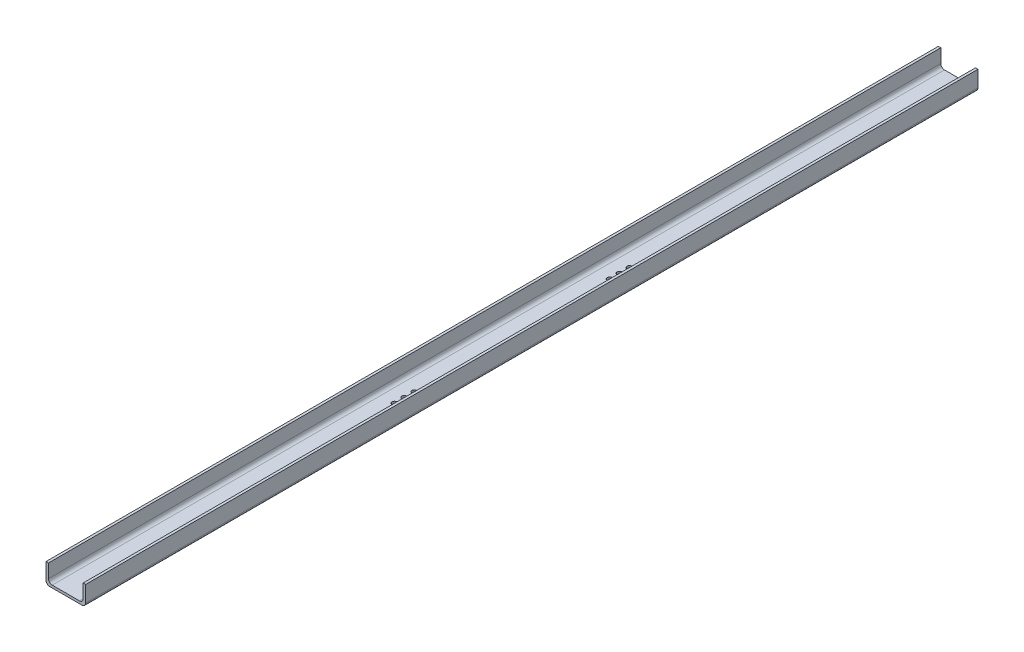
ISO-10303-21;
HEADER;
FILE_DESCRIPTION(('STEP AP214'),'2;1');
FILE_NAME('part.step','',(''),(''),'','','');
FILE_SCHEMA(('AUTOMOTIVE_DESIGN { 1 0 10303 214 1 1 1 1 }'));
ENDSEC;
DATA;
#1=APPLICATION_CONTEXT('core data for automotive mechanical design processes');
#2=APPLICATION_PROTOCOL_DEFINITION('international standard','automotive_design',2000,#1);
#3=PRODUCT_CONTEXT('',#1,'mechanical');
#4=PRODUCT('Part','Part','',(#3));
#5=PRODUCT_RELATED_PRODUCT_CATEGORY('part','',(#4));
#6=PRODUCT_DEFINITION_FORMATION('','',#4);
#7=PRODUCT_DEFINITION_CONTEXT('part definition',#1,'design');
#8=PRODUCT_DEFINITION('design','',#6,#7);
#9=PRODUCT_DEFINITION_SHAPE('','',#8);
#10=(LENGTH_UNIT() NAMED_UNIT(*) SI_UNIT(.MILLI.,.METRE.));
#11=(NAMED_UNIT(*) PLANE_ANGLE_UNIT() SI_UNIT($,.RADIAN.));
#12=(NAMED_UNIT(*) SI_UNIT($,.STERADIAN.) SOLID_ANGLE_UNIT());
#13=UNCERTAINTY_MEASURE_WITH_UNIT(LENGTH_MEASURE(1.E-05),#10,'distance_accuracy_value','');
#14=(GEOMETRIC_REPRESENTATION_CONTEXT(3) GLOBAL_UNCERTAINTY_ASSIGNED_CONTEXT((#13)) GLOBAL_UNIT_ASSIGNED_CONTEXT((#10,
#11,#12)) REPRESENTATION_CONTEXT('',''));
#15=CARTESIAN_POINT('',(0.,0.,0.));
#16=DIRECTION('',(0.,0.,1.));
#17=DIRECTION('',(1.,0.,0.));
#18=AXIS2_PLACEMENT_3D('',#15,#16,#17);
#19=CARTESIAN_POINT('',(-22.225,25.4,1143.));
#20=DIRECTION('',(0.,-1.,0.));
#21=DIRECTION('',(1.,0.,0.));
#22=AXIS2_PLACEMENT_3D('',#19,#20,#21);
#23=PLANE('',#22);
#24=DIRECTION('',(-1.,0.,0.));
#25=VECTOR('',#24,1.);
#26=CARTESIAN_POINT('',(-22.225,25.4,0.));
#27=LINE('',#26,#25);
#28=CARTESIAN_POINT('',(-22.225,25.4,0.));
#29=VERTEX_POINT('',#28);
#30=CARTESIAN_POINT('',(-25.4,25.4,0.));
#31=VERTEX_POINT('',#30);
#32=EDGE_CURVE('E147',#29,#31,#27,.T.);
#33=ORIENTED_EDGE('',*,*,#32,.T.);
#34=DIRECTION('',(0.,0.,-1.));
#35=VECTOR('',#34,1.);
#36=CARTESIAN_POINT('',(-25.4,25.4,1143.));
#37=LINE('',#36,#35);
#38=CARTESIAN_POINT('',(-25.4,25.4,1143.));
#39=VERTEX_POINT('',#38);
#40=EDGE_CURVE('E130',#39,#31,#37,.T.);
#41=ORIENTED_EDGE('',*,*,#40,.F.);
#42=DIRECTION('',(-1.,0.,0.));
#43=VECTOR('',#42,1.);
#44=CARTESIAN_POINT('',(-22.225,25.4,1143.));
#45=LINE('',#44,#43);
#46=CARTESIAN_POINT('',(-22.225,25.4,1143.));
#47=VERTEX_POINT('',#46);
#48=EDGE_CURVE('E135',#47,#39,#45,.T.);
#49=ORIENTED_EDGE('',*,*,#48,.F.);
#50=DIRECTION('',(0.,0.,-1.));
#51=VECTOR('',#50,1.);
#52=CARTESIAN_POINT('',(-22.225,25.4,1143.));
#53=LINE('',#52,#51);
#54=EDGE_CURVE('E221',#47,#29,#53,.T.);
#55=ORIENTED_EDGE('',*,*,#54,.T.);
#56=EDGE_LOOP('',(#33,#41,#49,#55));
#57=FACE_BOUND('',#56,.T.);
#58=ADVANCED_FACE('F38',(#57),#23,.F.);
#59=CARTESIAN_POINT('',(-25.4,25.4,1143.));
#60=DIRECTION('',(1.,0.,0.));
#61=DIRECTION('',(0.,1.,0.));
#62=AXIS2_PLACEMENT_3D('',#59,#60,#61);
#63=PLANE('',#62);
#64=DIRECTION('',(0.,-1.,0.));
#65=VECTOR('',#64,1.);
#66=CARTESIAN_POINT('',(-25.4,25.4,0.));
#67=LINE('',#66,#65);
#68=CARTESIAN_POINT('',(-25.4,4.7625,0.));
#69=VERTEX_POINT('',#68);
#70=EDGE_CURVE('E206',#31,#69,#67,.T.);
#71=ORIENTED_EDGE('',*,*,#70,.T.);
#72=DIRECTION('',(0.,0.,-1.));
#73=VECTOR('',#72,1.);
#74=CARTESIAN_POINT('',(-25.4,4.7625,1143.));
#75=LINE('',#74,#73);
#76=CARTESIAN_POINT('',(-25.4,4.7625,1143.));
#77=VERTEX_POINT('',#76);
#78=EDGE_CURVE('E11',#69,#77,#75,.F.);
#79=ORIENTED_EDGE('',*,*,#78,.T.);
#80=DIRECTION('',(0.,-1.,0.));
#81=VECTOR('',#80,1.);
#82=CARTESIAN_POINT('',(-25.4,25.4,1143.));
#83=LINE('',#82,#81);
#84=EDGE_CURVE('E126',#39,#77,#83,.T.);
#85=ORIENTED_EDGE('',*,*,#84,.F.);
#86=ORIENTED_EDGE('',*,*,#40,.T.);
#87=EDGE_LOOP('',(#71,#79,#85,#86));
#88=FACE_BOUND('',#87,.T.);
#89=ADVANCED_FACE('F128',(#88),#63,.F.);
#90=CARTESIAN_POINT('',(-25.4,0.,1143.));
#91=DIRECTION('',(0.,1.,0.));
#92=DIRECTION('',(-1.,0.,0.));
#93=AXIS2_PLACEMENT_3D('',#90,#91,#92);
#94=PLANE('',#93);
#95=CARTESIAN_POINT('',(0.,0.,722.));
#96=DIRECTION('',(0.,1.,0.));
#97=DIRECTION('',(0.,0.,1.));
#98=AXIS2_PLACEMENT_3D('',#95,#96,#97);
#99=CIRCLE('',#98,3.175);
#100=CARTESIAN_POINT('',(0.,0.,725.175));
#101=VERTEX_POINT('',#100);
#102=EDGE_CURVE('E332',#101,#101,#99,.T.);
#103=ORIENTED_EDGE('',*,*,#102,.T.);
#104=EDGE_LOOP('',(#103));
#105=FACE_BOUND('',#104,.T.);
#106=CARTESIAN_POINT('',(0.,0.,709.3));
#107=DIRECTION('',(0.,1.,0.));
#108=DIRECTION('',(0.,0.,1.));
#109=AXIS2_PLACEMENT_3D('',#106,#107,#108);
#110=CIRCLE('',#109,3.175);
#111=CARTESIAN_POINT('',(0.,0.,712.475));
#112=VERTEX_POINT('',#111);
#113=EDGE_CURVE('E342',#112,#112,#110,.T.);
#114=ORIENTED_EDGE('',*,*,#113,.T.);
#115=EDGE_LOOP('',(#114));
#116=FACE_BOUND('',#115,.T.);
#117=CARTESIAN_POINT('',(0.,0.,696.6));
#118=DIRECTION('',(0.,1.,0.));
#119=DIRECTION('',(0.,0.,1.));
#120=AXIS2_PLACEMENT_3D('',#117,#118,#119);
#121=CIRCLE('',#120,3.175);
#122=CARTESIAN_POINT('',(0.,0.,699.775));
#123=VERTEX_POINT('',#122);
#124=EDGE_CURVE('E348',#123,#123,#121,.T.);
#125=ORIENTED_EDGE('',*,*,#124,.T.);
#126=EDGE_LOOP('',(#125));
#127=FACE_BOUND('',#126,.T.);
#128=CARTESIAN_POINT('',(0.,0.,446.4));
#129=DIRECTION('',(0.,1.,0.));
#130=DIRECTION('',(0.,0.,1.));
#131=AXIS2_PLACEMENT_3D('',#128,#129,#130);
#132=CIRCLE('',#131,3.175);
#133=CARTESIAN_POINT('',(0.,0.,449.575));
#134=VERTEX_POINT('',#133);
#135=EDGE_CURVE('E354',#134,#134,#132,.T.);
#136=ORIENTED_EDGE('',*,*,#135,.T.);
#137=EDGE_LOOP('',(#136));
#138=FACE_BOUND('',#137,.T.);
#139=CARTESIAN_POINT('',(0.,0.,433.7));
#140=DIRECTION('',(0.,1.,0.));
#141=DIRECTION('',(0.,0.,1.));
#142=AXIS2_PLACEMENT_3D('',#139,#140,#141);
#143=CIRCLE('',#142,3.175);
#144=CARTESIAN_POINT('',(0.,0.,436.875));
#145=VERTEX_POINT('',#144);
#146=EDGE_CURVE('E255',#145,#145,#143,.T.);
#147=ORIENTED_EDGE('',*,*,#146,.T.);
#148=EDGE_LOOP('',(#147));
#149=FACE_BOUND('',#148,.T.);
#150=CARTESIAN_POINT('',(0.,0.,421.));
#151=DIRECTION('',(0.,1.,0.));
#152=DIRECTION('',(0.,0.,1.));
#153=AXIS2_PLACEMENT_3D('',#150,#151,#152);
#154=CIRCLE('',#153,3.175);
#155=CARTESIAN_POINT('',(0.,0.,424.175));
#156=VERTEX_POINT('',#155);
#157=EDGE_CURVE('E248',#156,#156,#154,.T.);
#158=ORIENTED_EDGE('',*,*,#157,.T.);
#159=EDGE_LOOP('',(#158));
#160=FACE_BOUND('',#159,.T.);
#161=DIRECTION('',(1.,0.,0.));
#162=VECTOR('',#161,1.);
#163=CARTESIAN_POINT('',(-25.4,0.,0.));
#164=LINE('',#163,#162);
#165=CARTESIAN_POINT('',(-20.6375,0.,0.));
#166=VERTEX_POINT('',#165);
#167=CARTESIAN_POINT('',(20.6375,0.,0.));
#168=VERTEX_POINT('',#167);
#169=EDGE_CURVE('E201',#166,#168,#164,.T.);
#170=ORIENTED_EDGE('',*,*,#169,.T.);
#171=DIRECTION('',(0.,0.,-1.));
#172=VECTOR('',#171,1.);
#173=CARTESIAN_POINT('',(20.6375,0.,1143.));
#174=LINE('',#173,#172);
#175=CARTESIAN_POINT('',(20.6375,0.,1143.));
#176=VERTEX_POINT('',#175);
#177=EDGE_CURVE('E59',#168,#176,#174,.F.);
#178=ORIENTED_EDGE('',*,*,#177,.T.);
#179=DIRECTION('',(1.,0.,0.));
#180=VECTOR('',#179,1.);
#181=CARTESIAN_POINT('',(-25.4,0.,1143.));
#182=LINE('',#181,#180);
#183=CARTESIAN_POINT('',(-20.6375,0.,1143.));
#184=VERTEX_POINT('',#183);
#185=EDGE_CURVE('E134',#184,#176,#182,.T.);
#186=ORIENTED_EDGE('',*,*,#185,.F.);
#187=DIRECTION('',(0.,0.,-1.));
#188=VECTOR('',#187,1.);
#189=CARTESIAN_POINT('',(-20.6375,0.,1143.));
#190=LINE('',#189,#188);
#191=EDGE_CURVE('E180',#184,#166,#190,.T.);
#192=ORIENTED_EDGE('',*,*,#191,.T.);
#193=EDGE_LOOP('',(#170,#178,#186,#192));
#194=FACE_BOUND('',#193,.T.);
#195=ADVANCED_FACE('F204',(#105,#116,#127,#138,#149,#160,#194),#94,.F.);
#196=CARTESIAN_POINT('',(25.4,0.,1143.));
#197=DIRECTION('',(-1.,0.,0.));
#198=DIRECTION('',(0.,-1.,0.));
#199=AXIS2_PLACEMENT_3D('',#196,#197,#198);
#200=PLANE('',#199);
#201=DIRECTION('',(0.,1.,0.));
#202=VECTOR('',#201,1.);
#203=CARTESIAN_POINT('',(25.4,0.,1143.));
#204=LINE('',#203,#202);
#205=CARTESIAN_POINT('',(25.4,4.76250000000001,1143.));
#206=VERTEX_POINT('',#205);
#207=CARTESIAN_POINT('',(25.4,25.4,1143.));
#208=VERTEX_POINT('',#207);
#209=EDGE_CURVE('E187',#206,#208,#204,.T.);
#210=ORIENTED_EDGE('',*,*,#209,.F.);
#211=DIRECTION('',(0.,0.,-1.));
#212=VECTOR('',#211,1.);
#213=CARTESIAN_POINT('',(25.4,4.76250000000001,1143.));
#214=LINE('',#213,#212);
#215=CARTESIAN_POINT('',(25.4,4.76250000000001,0.));
#216=VERTEX_POINT('',#215);
#217=EDGE_CURVE('E173',#206,#216,#214,.T.);
#218=ORIENTED_EDGE('',*,*,#217,.T.);
#219=DIRECTION('',(0.,1.,0.));
#220=VECTOR('',#219,1.);
#221=CARTESIAN_POINT('',(25.4,0.,0.));
#222=LINE('',#221,#220);
#223=CARTESIAN_POINT('',(25.4,25.4,0.));
#224=VERTEX_POINT('',#223);
#225=EDGE_CURVE('E203',#216,#224,#222,.T.);
#226=ORIENTED_EDGE('',*,*,#225,.T.);
#227=DIRECTION('',(0.,0.,-1.));
#228=VECTOR('',#227,1.);
#229=CARTESIAN_POINT('',(25.4,25.4,1143.));
#230=LINE('',#229,#228);
#231=EDGE_CURVE('E149',#208,#224,#230,.T.);
#232=ORIENTED_EDGE('',*,*,#231,.F.);
#233=EDGE_LOOP('',(#210,#218,#226,#232));
#234=FACE_BOUND('',#233,.T.);
#235=ADVANCED_FACE('F192',(#234),#200,.F.);
#236=CARTESIAN_POINT('',(25.4,25.4,1143.));
#237=DIRECTION('',(0.,-1.,0.));
#238=DIRECTION('',(1.,0.,0.));
#239=AXIS2_PLACEMENT_3D('',#236,#237,#238);
#240=PLANE('',#239);
#241=DIRECTION('',(-1.,0.,0.));
#242=VECTOR('',#241,1.);
#243=CARTESIAN_POINT('',(25.4,25.4,0.));
#244=LINE('',#243,#242);
#245=CARTESIAN_POINT('',(22.225,25.4,0.));
#246=VERTEX_POINT('',#245);
#247=EDGE_CURVE('E208',#224,#246,#244,.T.);
#248=ORIENTED_EDGE('',*,*,#247,.T.);
#249=DIRECTION('',(0.,0.,-1.));
#250=VECTOR('',#249,1.);
#251=CARTESIAN_POINT('',(22.225,25.4,1143.));
#252=LINE('',#251,#250);
#253=CARTESIAN_POINT('',(22.225,25.4,1143.));
#254=VERTEX_POINT('',#253);
#255=EDGE_CURVE('E154',#254,#246,#252,.T.);
#256=ORIENTED_EDGE('',*,*,#255,.F.);
#257=DIRECTION('',(-1.,0.,0.));
#258=VECTOR('',#257,1.);
#259=CARTESIAN_POINT('',(25.4,25.4,1143.));
#260=LINE('',#259,#258);
#261=EDGE_CURVE('E195',#208,#254,#260,.T.);
#262=ORIENTED_EDGE('',*,*,#261,.F.);
#263=ORIENTED_EDGE('',*,*,#231,.T.);
#264=EDGE_LOOP('',(#248,#256,#262,#263));
#265=FACE_BOUND('',#264,.T.);
#266=ADVANCED_FACE('F259',(#265),#240,.F.);
#267=CARTESIAN_POINT('',(22.225,25.4,1143.));
#268=DIRECTION('',(1.,0.,0.));
#269=DIRECTION('',(0.,1.,0.));
#270=AXIS2_PLACEMENT_3D('',#267,#268,#269);
#271=PLANE('',#270);
#272=DIRECTION('',(0.,-1.,0.));
#273=VECTOR('',#272,1.);
#274=CARTESIAN_POINT('',(22.225,25.4,0.));
#275=LINE('',#274,#273);
#276=CARTESIAN_POINT('',(22.225,7.93750000000001,0.));
#277=VERTEX_POINT('',#276);
#278=EDGE_CURVE('E214',#246,#277,#275,.T.);
#279=ORIENTED_EDGE('',*,*,#278,.T.);
#280=DIRECTION('',(0.,0.,-1.));
#281=VECTOR('',#280,1.);
#282=CARTESIAN_POINT('',(22.225,7.9375,1143.));
#283=LINE('',#282,#281);
#284=CARTESIAN_POINT('',(22.225,7.93750000000001,1143.));
#285=VERTEX_POINT('',#284);
#286=EDGE_CURVE('E160',#277,#285,#283,.F.);
#287=ORIENTED_EDGE('',*,*,#286,.T.);
#288=DIRECTION('',(0.,-1.,0.));
#289=VECTOR('',#288,1.);
#290=CARTESIAN_POINT('',(22.225,25.4,1143.));
#291=LINE('',#290,#289);
#292=EDGE_CURVE('E230',#254,#285,#291,.T.);
#293=ORIENTED_EDGE('',*,*,#292,.F.);
#294=ORIENTED_EDGE('',*,*,#255,.T.);
#295=EDGE_LOOP('',(#279,#287,#293,#294));
#296=FACE_BOUND('',#295,.T.);
#297=ADVANCED_FACE('F227',(#296),#271,.F.);
#298=CARTESIAN_POINT('',(22.225,3.175,1143.));
#299=DIRECTION('',(0.,-1.,0.));
#300=DIRECTION('',(1.,0.,0.));
#301=AXIS2_PLACEMENT_3D('',#298,#299,#300);
#302=PLANE('',#301);
#303=CARTESIAN_POINT('',(0.,3.175,722.));
#304=DIRECTION('',(0.,1.,0.));
#305=DIRECTION('',(0.,0.,1.));
#306=AXIS2_PLACEMENT_3D('',#303,#304,#305);
#307=CIRCLE('',#306,3.175);
#308=CARTESIAN_POINT('',(0.,3.175,725.175));
#309=VERTEX_POINT('',#308);
#310=EDGE_CURVE('E335',#309,#309,#307,.T.);
#311=ORIENTED_EDGE('',*,*,#310,.F.);
#312=EDGE_LOOP('',(#311));
#313=FACE_BOUND('',#312,.T.);
#314=CARTESIAN_POINT('',(0.,3.175,709.3));
#315=DIRECTION('',(0.,1.,0.));
#316=DIRECTION('',(0.,0.,1.));
#317=AXIS2_PLACEMENT_3D('',#314,#315,#316);
#318=CIRCLE('',#317,3.175);
#319=CARTESIAN_POINT('',(0.,3.175,712.475));
#320=VERTEX_POINT('',#319);
#321=EDGE_CURVE('E337',#320,#320,#318,.T.);
#322=ORIENTED_EDGE('',*,*,#321,.F.);
#323=EDGE_LOOP('',(#322));
#324=FACE_BOUND('',#323,.T.);
#325=CARTESIAN_POINT('',(0.,3.175,696.6));
#326=DIRECTION('',(0.,1.,0.));
#327=DIRECTION('',(0.,0.,1.));
#328=AXIS2_PLACEMENT_3D('',#325,#326,#327);
#329=CIRCLE('',#328,3.175);
#330=CARTESIAN_POINT('',(0.,3.175,699.775));
#331=VERTEX_POINT('',#330);
#332=EDGE_CURVE('E345',#331,#331,#329,.T.);
#333=ORIENTED_EDGE('',*,*,#332,.F.);
#334=EDGE_LOOP('',(#333));
#335=FACE_BOUND('',#334,.T.);
#336=CARTESIAN_POINT('',(0.,3.175,446.4));
#337=DIRECTION('',(0.,1.,0.));
#338=DIRECTION('',(0.,0.,1.));
#339=AXIS2_PLACEMENT_3D('',#336,#337,#338);
#340=CIRCLE('',#339,3.175);
#341=CARTESIAN_POINT('',(0.,3.175,449.575));
#342=VERTEX_POINT('',#341);
#343=EDGE_CURVE('E351',#342,#342,#340,.T.);
#344=ORIENTED_EDGE('',*,*,#343,.F.);
#345=EDGE_LOOP('',(#344));
#346=FACE_BOUND('',#345,.T.);
#347=CARTESIAN_POINT('',(0.,3.175,433.7));
#348=DIRECTION('',(0.,1.,0.));
#349=DIRECTION('',(0.,0.,1.));
#350=AXIS2_PLACEMENT_3D('',#347,#348,#349);
#351=CIRCLE('',#350,3.175);
#352=CARTESIAN_POINT('',(0.,3.175,436.875));
#353=VERTEX_POINT('',#352);
#354=EDGE_CURVE('E357',#353,#353,#351,.T.);
#355=ORIENTED_EDGE('',*,*,#354,.F.);
#356=EDGE_LOOP('',(#355));
#357=FACE_BOUND('',#356,.T.);
#358=CARTESIAN_POINT('',(0.,3.175,421.));
#359=DIRECTION('',(0.,1.,0.));
#360=DIRECTION('',(0.,0.,1.));
#361=AXIS2_PLACEMENT_3D('',#358,#359,#360);
#362=CIRCLE('',#361,3.175);
#363=CARTESIAN_POINT('',(0.,3.175,424.175));
#364=VERTEX_POINT('',#363);
#365=EDGE_CURVE('E250',#364,#364,#362,.T.);
#366=ORIENTED_EDGE('',*,*,#365,.F.);
#367=EDGE_LOOP('',(#366));
#368=FACE_BOUND('',#367,.T.);
#369=DIRECTION('',(-1.,0.,0.));
#370=VECTOR('',#369,1.);
#371=CARTESIAN_POINT('',(22.225,3.175,1143.));
#372=LINE('',#371,#370);
#373=CARTESIAN_POINT('',(17.4625,3.175,1143.));
#374=VERTEX_POINT('',#373);
#375=CARTESIAN_POINT('',(-17.4625,3.175,1143.));
#376=VERTEX_POINT('',#375);
#377=EDGE_CURVE('E242',#374,#376,#372,.T.);
#378=ORIENTED_EDGE('',*,*,#377,.F.);
#379=DIRECTION('',(0.,0.,-1.));
#380=VECTOR('',#379,1.);
#381=CARTESIAN_POINT('',(17.4625,3.175,0.));
#382=LINE('',#381,#380);
#383=CARTESIAN_POINT('',(17.4625,3.175,0.));
#384=VERTEX_POINT('',#383);
#385=EDGE_CURVE('E151',#374,#384,#382,.T.);
#386=ORIENTED_EDGE('',*,*,#385,.T.);
#387=DIRECTION('',(-1.,0.,0.));
#388=VECTOR('',#387,1.);
#389=CARTESIAN_POINT('',(22.225,3.175,0.));
#390=LINE('',#389,#388);
#391=CARTESIAN_POINT('',(-17.4625,3.175,0.));
#392=VERTEX_POINT('',#391);
#393=EDGE_CURVE('E217',#384,#392,#390,.T.);
#394=ORIENTED_EDGE('',*,*,#393,.T.);
#395=DIRECTION('',(0.,0.,-1.));
#396=VECTOR('',#395,1.);
#397=CARTESIAN_POINT('',(-17.4625,3.175,1143.));
#398=LINE('',#397,#396);
#399=EDGE_CURVE('E148',#392,#376,#398,.F.);
#400=ORIENTED_EDGE('',*,*,#399,.T.);
#401=EDGE_LOOP('',(#378,#386,#394,#400));
#402=FACE_BOUND('',#401,.T.);
#403=ADVANCED_FACE('F239',(#313,#324,#335,#346,#357,#368,#402),#302,.F.);
#404=CARTESIAN_POINT('',(-22.225,3.17499999999999,1143.));
#405=DIRECTION('',(-1.,0.,0.));
#406=DIRECTION('',(0.,-1.,0.));
#407=AXIS2_PLACEMENT_3D('',#404,#405,#406);
#408=PLANE('',#407);
#409=DIRECTION('',(0.,1.,0.));
#410=VECTOR('',#409,1.);
#411=CARTESIAN_POINT('',(-22.225,3.17499999999999,1143.));
#412=LINE('',#411,#410);
#413=CARTESIAN_POINT('',(-22.225,7.93749999999999,1143.));
#414=VERTEX_POINT('',#413);
#415=EDGE_CURVE('E140',#414,#47,#412,.T.);
#416=ORIENTED_EDGE('',*,*,#415,.F.);
#417=DIRECTION('',(0.,0.,-1.));
#418=VECTOR('',#417,1.);
#419=CARTESIAN_POINT('',(-22.225,7.93749999999999,0.));
#420=LINE('',#419,#418);
#421=CARTESIAN_POINT('',(-22.225,7.93749999999999,0.));
#422=VERTEX_POINT('',#421);
#423=EDGE_CURVE('E162',#414,#422,#420,.T.);
#424=ORIENTED_EDGE('',*,*,#423,.T.);
#425=DIRECTION('',(0.,1.,0.));
#426=VECTOR('',#425,1.);
#427=CARTESIAN_POINT('',(-22.225,3.17499999999999,0.));
#428=LINE('',#427,#426);
#429=EDGE_CURVE('E144',#422,#29,#428,.T.);
#430=ORIENTED_EDGE('',*,*,#429,.T.);
#431=ORIENTED_EDGE('',*,*,#54,.F.);
#432=EDGE_LOOP('',(#416,#424,#430,#431));
#433=FACE_BOUND('',#432,.T.);
#434=ADVANCED_FACE('F295',(#433),#408,.F.);
#435=CARTESIAN_POINT('',(0.,0.,1143.));
#436=DIRECTION('',(0.,0.,1.));
#437=DIRECTION('',(1.,0.,0.));
#438=AXIS2_PLACEMENT_3D('',#435,#436,#437);
#439=PLANE('',#438);
#440=ORIENTED_EDGE('',*,*,#185,.T.);
#441=CARTESIAN_POINT('',(20.6375,4.76250000000001,1143.));
#442=DIRECTION('',(0.,0.,1.));
#443=DIRECTION('',(1.,0.,0.));
#444=AXIS2_PLACEMENT_3D('',#441,#442,#443);
#445=CIRCLE('',#444,4.7625);
#446=EDGE_CURVE('E46',#176,#206,#445,.T.);
#447=ORIENTED_EDGE('',*,*,#446,.T.);
#448=ORIENTED_EDGE('',*,*,#209,.T.);
#449=ORIENTED_EDGE('',*,*,#261,.T.);
#450=ORIENTED_EDGE('',*,*,#292,.T.);
#451=CARTESIAN_POINT('',(17.4625,7.9375,1143.));
#452=DIRECTION('',(0.,0.,1.));
#453=DIRECTION('',(1.,0.,0.));
#454=AXIS2_PLACEMENT_3D('',#451,#452,#453);
#455=CIRCLE('',#454,4.7625);
#456=EDGE_CURVE('E167',#285,#374,#455,.F.);
#457=ORIENTED_EDGE('',*,*,#456,.T.);
#458=ORIENTED_EDGE('',*,*,#377,.T.);
#459=CARTESIAN_POINT('',(-17.4625,7.93749999999999,1143.));
#460=DIRECTION('',(0.,0.,1.));
#461=DIRECTION('',(1.,0.,0.));
#462=AXIS2_PLACEMENT_3D('',#459,#460,#461);
#463=CIRCLE('',#462,4.7625);
#464=EDGE_CURVE('E171',#376,#414,#463,.F.);
#465=ORIENTED_EDGE('',*,*,#464,.T.);
#466=ORIENTED_EDGE('',*,*,#415,.T.);
#467=ORIENTED_EDGE('',*,*,#48,.T.);
#468=ORIENTED_EDGE('',*,*,#84,.T.);
#469=CARTESIAN_POINT('',(-20.6375,4.7625,1143.));
#470=DIRECTION('',(0.,0.,1.));
#471=DIRECTION('',(1.,0.,0.));
#472=AXIS2_PLACEMENT_3D('',#469,#470,#471);
#473=CIRCLE('',#472,4.7625);
#474=EDGE_CURVE('E184',#77,#184,#473,.T.);
#475=ORIENTED_EDGE('',*,*,#474,.T.);
#476=EDGE_LOOP('',(#440,#447,#448,#449,#450,#457,#458,#465,#466,#467,#468,#475));
#477=FACE_BOUND('',#476,.T.);
#478=ADVANCED_FACE('F138',(#477),#439,.T.);
#479=CARTESIAN_POINT('',(0.,0.,0.));
#480=DIRECTION('',(0.,0.,1.));
#481=DIRECTION('',(1.,0.,0.));
#482=AXIS2_PLACEMENT_3D('',#479,#480,#481);
#483=PLANE('',#482);
#484=ORIENTED_EDGE('',*,*,#225,.F.);
#485=CARTESIAN_POINT('',(20.6375,4.76250000000001,0.));
#486=DIRECTION('',(0.,0.,1.));
#487=DIRECTION('',(1.,0.,0.));
#488=AXIS2_PLACEMENT_3D('',#485,#486,#487);
#489=CIRCLE('',#488,4.7625);
#490=EDGE_CURVE('E178',#216,#168,#489,.F.);
#491=ORIENTED_EDGE('',*,*,#490,.T.);
#492=ORIENTED_EDGE('',*,*,#169,.F.);
#493=CARTESIAN_POINT('',(-20.6375,4.7625,0.));
#494=DIRECTION('',(0.,0.,1.));
#495=DIRECTION('',(1.,0.,0.));
#496=AXIS2_PLACEMENT_3D('',#493,#494,#495);
#497=CIRCLE('',#496,4.7625);
#498=EDGE_CURVE('E176',#166,#69,#497,.F.);
#499=ORIENTED_EDGE('',*,*,#498,.T.);
#500=ORIENTED_EDGE('',*,*,#70,.F.);
#501=ORIENTED_EDGE('',*,*,#32,.F.);
#502=ORIENTED_EDGE('',*,*,#429,.F.);
#503=CARTESIAN_POINT('',(-17.4625,7.93749999999999,0.));
#504=DIRECTION('',(0.,0.,1.));
#505=DIRECTION('',(1.,0.,0.));
#506=AXIS2_PLACEMENT_3D('',#503,#504,#505);
#507=CIRCLE('',#506,4.7625);
#508=EDGE_CURVE('E169',#422,#392,#507,.T.);
#509=ORIENTED_EDGE('',*,*,#508,.T.);
#510=ORIENTED_EDGE('',*,*,#393,.F.);
#511=CARTESIAN_POINT('',(17.4625,7.9375,0.));
#512=DIRECTION('',(0.,0.,1.));
#513=DIRECTION('',(1.,0.,0.));
#514=AXIS2_PLACEMENT_3D('',#511,#512,#513);
#515=CIRCLE('',#514,4.7625);
#516=EDGE_CURVE('E165',#384,#277,#515,.T.);
#517=ORIENTED_EDGE('',*,*,#516,.T.);
#518=ORIENTED_EDGE('',*,*,#278,.F.);
#519=ORIENTED_EDGE('',*,*,#247,.F.);
#520=EDGE_LOOP('',(#484,#491,#492,#499,#500,#501,#502,#509,#510,#517,#518,#519));
#521=FACE_BOUND('',#520,.T.);
#522=ADVANCED_FACE('F200',(#521),#483,.F.);
#523=CARTESIAN_POINT('',(17.4625,7.9375,1143.));
#524=DIRECTION('',(0.,0.,1.));
#525=DIRECTION('',(1.,0.,0.));
#526=AXIS2_PLACEMENT_3D('',#523,#524,#525);
#527=CYLINDRICAL_SURFACE('',#526,4.7625);
#528=ORIENTED_EDGE('',*,*,#456,.F.);
#529=ORIENTED_EDGE('',*,*,#286,.F.);
#530=ORIENTED_EDGE('',*,*,#516,.F.);
#531=ORIENTED_EDGE('',*,*,#385,.F.);
#532=EDGE_LOOP('',(#528,#529,#530,#531));
#533=FACE_BOUND('',#532,.T.);
#534=ADVANCED_FACE('F236',(#533),#527,.F.);
#535=CARTESIAN_POINT('',(-17.4625,7.93749999999999,1143.));
#536=DIRECTION('',(0.,0.,1.));
#537=DIRECTION('',(1.,0.,0.));
#538=AXIS2_PLACEMENT_3D('',#535,#536,#537);
#539=CYLINDRICAL_SURFACE('',#538,4.7625);
#540=ORIENTED_EDGE('',*,*,#464,.F.);
#541=ORIENTED_EDGE('',*,*,#399,.F.);
#542=ORIENTED_EDGE('',*,*,#508,.F.);
#543=ORIENTED_EDGE('',*,*,#423,.F.);
#544=EDGE_LOOP('',(#540,#541,#542,#543));
#545=FACE_BOUND('',#544,.T.);
#546=ADVANCED_FACE('F278',(#545),#539,.F.);
#547=CARTESIAN_POINT('',(20.6375,4.76250000000001,1143.));
#548=DIRECTION('',(0.,0.,-1.));
#549=DIRECTION('',(-1.,0.,0.));
#550=AXIS2_PLACEMENT_3D('',#547,#548,#549);
#551=CYLINDRICAL_SURFACE('',#550,4.7625);
#552=ORIENTED_EDGE('',*,*,#446,.F.);
#553=ORIENTED_EDGE('',*,*,#177,.F.);
#554=ORIENTED_EDGE('',*,*,#490,.F.);
#555=ORIENTED_EDGE('',*,*,#217,.F.);
#556=EDGE_LOOP('',(#552,#553,#554,#555));
#557=FACE_BOUND('',#556,.T.);
#558=ADVANCED_FACE('F197',(#557),#551,.T.);
#559=CARTESIAN_POINT('',(-20.6375,4.7625,1143.));
#560=DIRECTION('',(0.,0.,-1.));
#561=DIRECTION('',(-1.,0.,0.));
#562=AXIS2_PLACEMENT_3D('',#559,#560,#561);
#563=CYLINDRICAL_SURFACE('',#562,4.7625);
#564=ORIENTED_EDGE('',*,*,#474,.F.);
#565=ORIENTED_EDGE('',*,*,#78,.F.);
#566=ORIENTED_EDGE('',*,*,#498,.F.);
#567=ORIENTED_EDGE('',*,*,#191,.F.);
#568=EDGE_LOOP('',(#564,#565,#566,#567));
#569=FACE_BOUND('',#568,.T.);
#570=ADVANCED_FACE('F40',(#569),#563,.T.);
#571=CARTESIAN_POINT('',(0.,3.175,421.));
#572=DIRECTION('',(0.,1.,0.));
#573=DIRECTION('',(0.,0.,1.));
#574=AXIS2_PLACEMENT_3D('',#571,#572,#573);
#575=CYLINDRICAL_SURFACE('',#574,3.175);
#576=ORIENTED_EDGE('',*,*,#157,.F.);
#577=EDGE_LOOP('',(#576));
#578=FACE_BOUND('',#577,.T.);
#579=ORIENTED_EDGE('',*,*,#365,.T.);
#580=EDGE_LOOP('',(#579));
#581=FACE_BOUND('',#580,.T.);
#582=ADVANCED_FACE('F285',(#578,#581),#575,.F.);
#583=CARTESIAN_POINT('',(0.,3.175,433.7));
#584=DIRECTION('',(0.,1.,0.));
#585=DIRECTION('',(0.,0.,1.));
#586=AXIS2_PLACEMENT_3D('',#583,#584,#585);
#587=CYLINDRICAL_SURFACE('',#586,3.175);
#588=ORIENTED_EDGE('',*,*,#146,.F.);
#589=EDGE_LOOP('',(#588));
#590=FACE_BOUND('',#589,.T.);
#591=ORIENTED_EDGE('',*,*,#354,.T.);
#592=EDGE_LOOP('',(#591));
#593=FACE_BOUND('',#592,.T.);
#594=ADVANCED_FACE('F290',(#590,#593),#587,.F.);
#595=CARTESIAN_POINT('',(0.,3.175,446.4));
#596=DIRECTION('',(0.,1.,0.));
#597=DIRECTION('',(0.,0.,1.));
#598=AXIS2_PLACEMENT_3D('',#595,#596,#597);
#599=CYLINDRICAL_SURFACE('',#598,3.175);
#600=ORIENTED_EDGE('',*,*,#135,.F.);
#601=EDGE_LOOP('',(#600));
#602=FACE_BOUND('',#601,.T.);
#603=ORIENTED_EDGE('',*,*,#343,.T.);
#604=EDGE_LOOP('',(#603));
#605=FACE_BOUND('',#604,.T.);
#606=ADVANCED_FACE('F311',(#602,#605),#599,.F.);
#607=CARTESIAN_POINT('',(0.,3.175,696.6));
#608=DIRECTION('',(0.,1.,0.));
#609=DIRECTION('',(0.,0.,1.));
#610=AXIS2_PLACEMENT_3D('',#607,#608,#609);
#611=CYLINDRICAL_SURFACE('',#610,3.175);
#612=ORIENTED_EDGE('',*,*,#124,.F.);
#613=EDGE_LOOP('',(#612));
#614=FACE_BOUND('',#613,.T.);
#615=ORIENTED_EDGE('',*,*,#332,.T.);
#616=EDGE_LOOP('',(#615));
#617=FACE_BOUND('',#616,.T.);
#618=ADVANCED_FACE('F315',(#614,#617),#611,.F.);
#619=CARTESIAN_POINT('',(0.,3.175,709.3));
#620=DIRECTION('',(0.,1.,0.));
#621=DIRECTION('',(0.,0.,1.));
#622=AXIS2_PLACEMENT_3D('',#619,#620,#621);
#623=CYLINDRICAL_SURFACE('',#622,3.175);
#624=ORIENTED_EDGE('',*,*,#113,.F.);
#625=EDGE_LOOP('',(#624));
#626=FACE_BOUND('',#625,.T.);
#627=ORIENTED_EDGE('',*,*,#321,.T.);
#628=EDGE_LOOP('',(#627));
#629=FACE_BOUND('',#628,.T.);
#630=ADVANCED_FACE('F319',(#626,#629),#623,.F.);
#631=CARTESIAN_POINT('',(0.,3.175,722.));
#632=DIRECTION('',(0.,1.,0.));
#633=DIRECTION('',(0.,0.,1.));
#634=AXIS2_PLACEMENT_3D('',#631,#632,#633);
#635=CYLINDRICAL_SURFACE('',#634,3.175);
#636=ORIENTED_EDGE('',*,*,#102,.F.);
#637=EDGE_LOOP('',(#636));
#638=FACE_BOUND('',#637,.T.);
#639=ORIENTED_EDGE('',*,*,#310,.T.);
#640=EDGE_LOOP('',(#639));
#641=FACE_BOUND('',#640,.T.);
#642=ADVANCED_FACE('F323',(#638,#641),#635,.F.);
#643=CLOSED_SHELL('',(#58,#89,#195,#235,#266,#297,#403,#434,#478,#522,#534,#546,#558,#570,#582,
#594,#606,#618,#630,#642));
#644=MANIFOLD_SOLID_BREP('B2',#643);
#645=ADVANCED_BREP_SHAPE_REPRESENTATION('',(#18,#644),#14);
#646=SHAPE_DEFINITION_REPRESENTATION(#9,#645);
ENDSEC;
END-ISO-10303-21;
